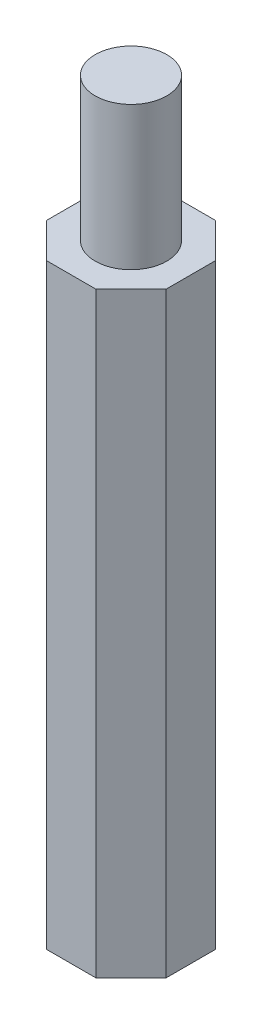
ISO-10303-21;
HEADER;
FILE_DESCRIPTION(('STEP AP214'),'2;1');
FILE_NAME('part.step','',(''),(''),'','','');
FILE_SCHEMA(('AUTOMOTIVE_DESIGN { 1 0 10303 214 1 1 1 1 }'));
ENDSEC;
DATA;
#1=APPLICATION_CONTEXT('core data for automotive mechanical design processes');
#2=APPLICATION_PROTOCOL_DEFINITION('international standard','automotive_design',2000,#1);
#3=PRODUCT_CONTEXT('',#1,'mechanical');
#4=PRODUCT('Part','Part','',(#3));
#5=PRODUCT_RELATED_PRODUCT_CATEGORY('part','',(#4));
#6=PRODUCT_DEFINITION_FORMATION('','',#4);
#7=PRODUCT_DEFINITION_CONTEXT('part definition',#1,'design');
#8=PRODUCT_DEFINITION('design','',#6,#7);
#9=PRODUCT_DEFINITION_SHAPE('','',#8);
#10=(LENGTH_UNIT() NAMED_UNIT(*) SI_UNIT(.MILLI.,.METRE.));
#11=(NAMED_UNIT(*) PLANE_ANGLE_UNIT() SI_UNIT($,.RADIAN.));
#12=(NAMED_UNIT(*) SI_UNIT($,.STERADIAN.) SOLID_ANGLE_UNIT());
#13=UNCERTAINTY_MEASURE_WITH_UNIT(LENGTH_MEASURE(1.E-05),#10,'distance_accuracy_value','');
#14=(GEOMETRIC_REPRESENTATION_CONTEXT(3) GLOBAL_UNCERTAINTY_ASSIGNED_CONTEXT((#13)) GLOBAL_UNIT_ASSIGNED_CONTEXT((#10,
#11,#12)) REPRESENTATION_CONTEXT('',''));
#15=CARTESIAN_POINT('',(0.,0.,0.));
#16=DIRECTION('',(0.,0.,1.));
#17=DIRECTION('',(1.,0.,0.));
#18=AXIS2_PLACEMENT_3D('',#15,#16,#17);
#19=CARTESIAN_POINT('',(-3.53553390593274,12.5,0.));
#20=DIRECTION('',(0.,1.,0.));
#21=DIRECTION('',(0.,0.,1.));
#22=AXIS2_PLACEMENT_3D('',#19,#20,#21);
#23=PLANE('',#22);
#24=DIRECTION('',(-0.707106781186549,0.,0.707106781186547));
#25=VECTOR('',#24,1.);
#26=CARTESIAN_POINT('',(-2.5,12.5,-1.03553390593274));
#27=LINE('',#26,#25);
#28=CARTESIAN_POINT('',(-1.03553390593274,12.5,-2.5));
#29=VERTEX_POINT('',#28);
#30=CARTESIAN_POINT('',(-2.5,12.5,-1.03553390593274));
#31=VERTEX_POINT('',#30);
#32=EDGE_CURVE('E144',#29,#31,#27,.T.);
#33=ORIENTED_EDGE('',*,*,#32,.T.);
#34=DIRECTION('',(0.,0.,1.));
#35=VECTOR('',#34,1.);
#36=CARTESIAN_POINT('',(-2.5,12.5,1.03553390593274));
#37=LINE('',#36,#35);
#38=CARTESIAN_POINT('',(-2.5,12.5,1.03553390593274));
#39=VERTEX_POINT('',#38);
#40=EDGE_CURVE('E92',#31,#39,#37,.T.);
#41=ORIENTED_EDGE('',*,*,#40,.T.);
#42=DIRECTION('',(0.707106781186548,0.,0.707106781186547));
#43=VECTOR('',#42,1.);
#44=CARTESIAN_POINT('',(-1.03553390593274,12.5,2.5));
#45=LINE('',#44,#43);
#46=CARTESIAN_POINT('',(-1.03553390593274,12.5,2.5));
#47=VERTEX_POINT('',#46);
#48=EDGE_CURVE('E159',#39,#47,#45,.T.);
#49=ORIENTED_EDGE('',*,*,#48,.T.);
#50=DIRECTION('',(1.,0.,0.));
#51=VECTOR('',#50,1.);
#52=CARTESIAN_POINT('',(1.03553390593274,12.5,2.5));
#53=LINE('',#52,#51);
#54=CARTESIAN_POINT('',(1.03553390593274,12.5,2.5));
#55=VERTEX_POINT('',#54);
#56=EDGE_CURVE('E171',#47,#55,#53,.T.);
#57=ORIENTED_EDGE('',*,*,#56,.T.);
#58=DIRECTION('',(0.707106781186548,0.,-0.707106781186547));
#59=VECTOR('',#58,1.);
#60=CARTESIAN_POINT('',(2.5,12.5,1.03553390593274));
#61=LINE('',#60,#59);
#62=CARTESIAN_POINT('',(2.5,12.5,1.03553390593274));
#63=VERTEX_POINT('',#62);
#64=EDGE_CURVE('E111',#55,#63,#61,.T.);
#65=ORIENTED_EDGE('',*,*,#64,.T.);
#66=DIRECTION('',(0.,0.,-1.));
#67=VECTOR('',#66,1.);
#68=CARTESIAN_POINT('',(2.5,12.5,-1.03553390593274));
#69=LINE('',#68,#67);
#70=CARTESIAN_POINT('',(2.5,12.5,-1.03553390593274));
#71=VERTEX_POINT('',#70);
#72=EDGE_CURVE('E105',#63,#71,#69,.T.);
#73=ORIENTED_EDGE('',*,*,#72,.T.);
#74=DIRECTION('',(-0.707106781186548,0.,-0.707106781186547));
#75=VECTOR('',#74,1.);
#76=CARTESIAN_POINT('',(1.03553390593274,12.5,-2.5));
#77=LINE('',#76,#75);
#78=CARTESIAN_POINT('',(1.03553390593274,12.5,-2.5));
#79=VERTEX_POINT('',#78);
#80=EDGE_CURVE('E109',#71,#79,#77,.T.);
#81=ORIENTED_EDGE('',*,*,#80,.T.);
#82=DIRECTION('',(-1.,0.,0.));
#83=VECTOR('',#82,1.);
#84=CARTESIAN_POINT('',(-1.03553390593274,12.5,-2.5));
#85=LINE('',#84,#83);
#86=EDGE_CURVE('E49',#79,#29,#85,.T.);
#87=ORIENTED_EDGE('',*,*,#86,.T.);
#88=EDGE_LOOP('',(#33,#41,#49,#57,#65,#73,#81,#87));
#89=FACE_BOUND('',#88,.T.);
#90=CARTESIAN_POINT('',(0.,12.5,0.));
#91=DIRECTION('',(0.,1.,0.));
#92=DIRECTION('',(0.,0.,1.));
#93=AXIS2_PLACEMENT_3D('',#90,#91,#92);
#94=CIRCLE('',#93,1.5);
#95=CARTESIAN_POINT('',(0.,12.5,1.5));
#96=VERTEX_POINT('',#95);
#97=EDGE_CURVE('E177',#96,#96,#94,.T.);
#98=ORIENTED_EDGE('',*,*,#97,.F.);
#99=EDGE_LOOP('',(#98));
#100=FACE_BOUND('',#99,.T.);
#101=ADVANCED_FACE('F32',(#89,#100),#23,.T.);
#102=CARTESIAN_POINT('',(-2.5,12.5,-1.03553390593274));
#103=DIRECTION('',(0.707106781186547,0.,0.707106781186548));
#104=DIRECTION('',(0.707106781186548,0.,-0.707106781186547));
#105=AXIS2_PLACEMENT_3D('',#102,#103,#104);
#106=PLANE('',#105);
#107=DIRECTION('',(-0.707106781186549,0.,0.707106781186547));
#108=VECTOR('',#107,1.);
#109=CARTESIAN_POINT('',(-2.5,-12.5,-1.03553390593274));
#110=LINE('',#109,#108);
#111=CARTESIAN_POINT('',(-1.03553390593274,-12.5,-2.5));
#112=VERTEX_POINT('',#111);
#113=CARTESIAN_POINT('',(-2.5,-12.5,-1.03553390593274));
#114=VERTEX_POINT('',#113);
#115=EDGE_CURVE('E129',#112,#114,#110,.T.);
#116=ORIENTED_EDGE('',*,*,#115,.T.);
#117=DIRECTION('',(0.,-1.,0.));
#118=VECTOR('',#117,1.);
#119=CARTESIAN_POINT('',(-2.5,12.5,-1.03553390593274));
#120=LINE('',#119,#118);
#121=EDGE_CURVE('E11',#31,#114,#120,.T.);
#122=ORIENTED_EDGE('',*,*,#121,.F.);
#123=ORIENTED_EDGE('',*,*,#32,.F.);
#124=DIRECTION('',(0.,-1.,0.));
#125=VECTOR('',#124,1.);
#126=CARTESIAN_POINT('',(-1.03553390593274,12.5,-2.5));
#127=LINE('',#126,#125);
#128=EDGE_CURVE('E125',#29,#112,#127,.T.);
#129=ORIENTED_EDGE('',*,*,#128,.T.);
#130=EDGE_LOOP('',(#116,#122,#123,#129));
#131=FACE_BOUND('',#130,.T.);
#132=ADVANCED_FACE('F34',(#131),#106,.F.);
#133=CARTESIAN_POINT('',(-2.5,12.5,1.03553390593274));
#134=DIRECTION('',(1.,0.,0.));
#135=DIRECTION('',(0.,0.,-1.));
#136=AXIS2_PLACEMENT_3D('',#133,#134,#135);
#137=PLANE('',#136);
#138=DIRECTION('',(0.,0.,1.));
#139=VECTOR('',#138,1.);
#140=CARTESIAN_POINT('',(-2.5,-12.5,1.03553390593274));
#141=LINE('',#140,#139);
#142=CARTESIAN_POINT('',(-2.5,-12.5,1.03553390593274));
#143=VERTEX_POINT('',#142);
#144=EDGE_CURVE('E132',#114,#143,#141,.T.);
#145=ORIENTED_EDGE('',*,*,#144,.T.);
#146=DIRECTION('',(0.,-1.,0.));
#147=VECTOR('',#146,1.);
#148=CARTESIAN_POINT('',(-2.5,12.5,1.03553390593274));
#149=LINE('',#148,#147);
#150=EDGE_CURVE('E41',#39,#143,#149,.T.);
#151=ORIENTED_EDGE('',*,*,#150,.F.);
#152=ORIENTED_EDGE('',*,*,#40,.F.);
#153=ORIENTED_EDGE('',*,*,#121,.T.);
#154=EDGE_LOOP('',(#145,#151,#152,#153));
#155=FACE_BOUND('',#154,.T.);
#156=ADVANCED_FACE('F214',(#155),#137,.F.);
#157=CARTESIAN_POINT('',(-1.03553390593274,12.5,2.5));
#158=DIRECTION('',(0.707106781186547,0.,-0.707106781186548));
#159=DIRECTION('',(-0.707106781186548,0.,-0.707106781186547));
#160=AXIS2_PLACEMENT_3D('',#157,#158,#159);
#161=PLANE('',#160);
#162=DIRECTION('',(0.707106781186548,0.,0.707106781186547));
#163=VECTOR('',#162,1.);
#164=CARTESIAN_POINT('',(-1.03553390593274,-12.5,2.5));
#165=LINE('',#164,#163);
#166=CARTESIAN_POINT('',(-1.03553390593274,-12.5,2.5));
#167=VERTEX_POINT('',#166);
#168=EDGE_CURVE('E135',#143,#167,#165,.T.);
#169=ORIENTED_EDGE('',*,*,#168,.T.);
#170=DIRECTION('',(0.,-1.,0.));
#171=VECTOR('',#170,1.);
#172=CARTESIAN_POINT('',(-1.03553390593274,12.5,2.5));
#173=LINE('',#172,#171);
#174=EDGE_CURVE('E151',#47,#167,#173,.T.);
#175=ORIENTED_EDGE('',*,*,#174,.F.);
#176=ORIENTED_EDGE('',*,*,#48,.F.);
#177=ORIENTED_EDGE('',*,*,#150,.T.);
#178=EDGE_LOOP('',(#169,#175,#176,#177));
#179=FACE_BOUND('',#178,.T.);
#180=ADVANCED_FACE('F157',(#179),#161,.F.);
#181=CARTESIAN_POINT('',(1.03553390593274,12.5,2.5));
#182=DIRECTION('',(0.,0.,-1.));
#183=DIRECTION('',(-1.,0.,0.));
#184=AXIS2_PLACEMENT_3D('',#181,#182,#183);
#185=PLANE('',#184);
#186=DIRECTION('',(1.,0.,0.));
#187=VECTOR('',#186,1.);
#188=CARTESIAN_POINT('',(1.03553390593274,-12.5,2.5));
#189=LINE('',#188,#187);
#190=CARTESIAN_POINT('',(1.03553390593274,-12.5,2.5));
#191=VERTEX_POINT('',#190);
#192=EDGE_CURVE('E137',#167,#191,#189,.T.);
#193=ORIENTED_EDGE('',*,*,#192,.T.);
#194=DIRECTION('',(0.,-1.,0.));
#195=VECTOR('',#194,1.);
#196=CARTESIAN_POINT('',(1.03553390593274,12.5,2.5));
#197=LINE('',#196,#195);
#198=EDGE_CURVE('E148',#55,#191,#197,.T.);
#199=ORIENTED_EDGE('',*,*,#198,.F.);
#200=ORIENTED_EDGE('',*,*,#56,.F.);
#201=ORIENTED_EDGE('',*,*,#174,.T.);
#202=EDGE_LOOP('',(#193,#199,#200,#201));
#203=FACE_BOUND('',#202,.T.);
#204=ADVANCED_FACE('F167',(#203),#185,.F.);
#205=CARTESIAN_POINT('',(2.5,12.5,1.03553390593274));
#206=DIRECTION('',(-0.707106781186547,0.,-0.707106781186548));
#207=DIRECTION('',(-0.707106781186548,0.,0.707106781186547));
#208=AXIS2_PLACEMENT_3D('',#205,#206,#207);
#209=PLANE('',#208);
#210=DIRECTION('',(0.707106781186548,0.,-0.707106781186547));
#211=VECTOR('',#210,1.);
#212=CARTESIAN_POINT('',(2.5,-12.5,1.03553390593274));
#213=LINE('',#212,#211);
#214=CARTESIAN_POINT('',(2.5,-12.5,1.03553390593274));
#215=VERTEX_POINT('',#214);
#216=EDGE_CURVE('E139',#191,#215,#213,.T.);
#217=ORIENTED_EDGE('',*,*,#216,.T.);
#218=DIRECTION('',(0.,-1.,0.));
#219=VECTOR('',#218,1.);
#220=CARTESIAN_POINT('',(2.5,12.5,1.03553390593274));
#221=LINE('',#220,#219);
#222=EDGE_CURVE('E120',#63,#215,#221,.T.);
#223=ORIENTED_EDGE('',*,*,#222,.F.);
#224=ORIENTED_EDGE('',*,*,#64,.F.);
#225=ORIENTED_EDGE('',*,*,#198,.T.);
#226=EDGE_LOOP('',(#217,#223,#224,#225));
#227=FACE_BOUND('',#226,.T.);
#228=ADVANCED_FACE('F170',(#227),#209,.F.);
#229=CARTESIAN_POINT('',(2.5,12.5,-1.03553390593274));
#230=DIRECTION('',(-1.,0.,0.));
#231=DIRECTION('',(0.,0.,1.));
#232=AXIS2_PLACEMENT_3D('',#229,#230,#231);
#233=PLANE('',#232);
#234=DIRECTION('',(0.,0.,-1.));
#235=VECTOR('',#234,1.);
#236=CARTESIAN_POINT('',(2.5,-12.5,-1.03553390593274));
#237=LINE('',#236,#235);
#238=CARTESIAN_POINT('',(2.5,-12.5,-1.03553390593274));
#239=VERTEX_POINT('',#238);
#240=EDGE_CURVE('E119',#215,#239,#237,.T.);
#241=ORIENTED_EDGE('',*,*,#240,.T.);
#242=DIRECTION('',(0.,-1.,0.));
#243=VECTOR('',#242,1.);
#244=CARTESIAN_POINT('',(2.5,12.5,-1.03553390593274));
#245=LINE('',#244,#243);
#246=EDGE_CURVE('E116',#71,#239,#245,.T.);
#247=ORIENTED_EDGE('',*,*,#246,.F.);
#248=ORIENTED_EDGE('',*,*,#72,.F.);
#249=ORIENTED_EDGE('',*,*,#222,.T.);
#250=EDGE_LOOP('',(#241,#247,#248,#249));
#251=FACE_BOUND('',#250,.T.);
#252=ADVANCED_FACE('F117',(#251),#233,.F.);
#253=CARTESIAN_POINT('',(1.03553390593274,12.5,-2.5));
#254=DIRECTION('',(-0.707106781186547,0.,0.707106781186548));
#255=DIRECTION('',(0.707106781186548,0.,0.707106781186547));
#256=AXIS2_PLACEMENT_3D('',#253,#254,#255);
#257=PLANE('',#256);
#258=DIRECTION('',(-0.707106781186548,0.,-0.707106781186547));
#259=VECTOR('',#258,1.);
#260=CARTESIAN_POINT('',(1.03553390593274,-12.5,-2.5));
#261=LINE('',#260,#259);
#262=CARTESIAN_POINT('',(1.03553390593274,-12.5,-2.5));
#263=VERTEX_POINT('',#262);
#264=EDGE_CURVE('E78',#239,#263,#261,.T.);
#265=ORIENTED_EDGE('',*,*,#264,.T.);
#266=DIRECTION('',(0.,-1.,0.));
#267=VECTOR('',#266,1.);
#268=CARTESIAN_POINT('',(1.03553390593274,12.5,-2.5));
#269=LINE('',#268,#267);
#270=EDGE_CURVE('E121',#79,#263,#269,.T.);
#271=ORIENTED_EDGE('',*,*,#270,.F.);
#272=ORIENTED_EDGE('',*,*,#80,.F.);
#273=ORIENTED_EDGE('',*,*,#246,.T.);
#274=EDGE_LOOP('',(#265,#271,#272,#273));
#275=FACE_BOUND('',#274,.T.);
#276=ADVANCED_FACE('F123',(#275),#257,.F.);
#277=CARTESIAN_POINT('',(-1.03553390593274,12.5,-2.5));
#278=DIRECTION('',(0.,0.,1.));
#279=DIRECTION('',(1.,0.,0.));
#280=AXIS2_PLACEMENT_3D('',#277,#278,#279);
#281=PLANE('',#280);
#282=DIRECTION('',(-1.,0.,0.));
#283=VECTOR('',#282,1.);
#284=CARTESIAN_POINT('',(-1.03553390593274,-12.5,-2.5));
#285=LINE('',#284,#283);
#286=EDGE_CURVE('E84',#263,#112,#285,.T.);
#287=ORIENTED_EDGE('',*,*,#286,.T.);
#288=ORIENTED_EDGE('',*,*,#128,.F.);
#289=ORIENTED_EDGE('',*,*,#86,.F.);
#290=ORIENTED_EDGE('',*,*,#270,.T.);
#291=EDGE_LOOP('',(#287,#288,#289,#290));
#292=FACE_BOUND('',#291,.T.);
#293=ADVANCED_FACE('F200',(#292),#281,.F.);
#294=CARTESIAN_POINT('',(-3.53553390593274,-12.5,0.));
#295=DIRECTION('',(0.,1.,0.));
#296=DIRECTION('',(0.,0.,1.));
#297=AXIS2_PLACEMENT_3D('',#294,#295,#296);
#298=PLANE('',#297);
#299=CARTESIAN_POINT('',(0.,-12.5,0.));
#300=DIRECTION('',(0.,-1.,0.));
#301=DIRECTION('',(0.,0.,-1.));
#302=AXIS2_PLACEMENT_3D('',#299,#300,#301);
#303=CIRCLE('',#302,1.5);
#304=CARTESIAN_POINT('',(0.,-12.5,-1.5));
#305=VERTEX_POINT('',#304);
#306=EDGE_CURVE('E183',#305,#305,#303,.T.);
#307=ORIENTED_EDGE('',*,*,#306,.F.);
#308=EDGE_LOOP('',(#307));
#309=FACE_BOUND('',#308,.T.);
#310=ORIENTED_EDGE('',*,*,#115,.F.);
#311=ORIENTED_EDGE('',*,*,#286,.F.);
#312=ORIENTED_EDGE('',*,*,#264,.F.);
#313=ORIENTED_EDGE('',*,*,#240,.F.);
#314=ORIENTED_EDGE('',*,*,#216,.F.);
#315=ORIENTED_EDGE('',*,*,#192,.F.);
#316=ORIENTED_EDGE('',*,*,#168,.F.);
#317=ORIENTED_EDGE('',*,*,#144,.F.);
#318=EDGE_LOOP('',(#310,#311,#312,#313,#314,#315,#316,#317));
#319=FACE_BOUND('',#318,.T.);
#320=ADVANCED_FACE('F163',(#309,#319),#298,.F.);
#321=CARTESIAN_POINT('',(0.,18.5,0.));
#322=DIRECTION('',(0.,-1.,0.));
#323=DIRECTION('',(0.,0.,-1.));
#324=AXIS2_PLACEMENT_3D('',#321,#322,#323);
#325=CYLINDRICAL_SURFACE('',#324,1.5);
#326=CARTESIAN_POINT('',(0.,18.5,0.));
#327=DIRECTION('',(0.,1.,0.));
#328=DIRECTION('',(0.,0.,1.));
#329=AXIS2_PLACEMENT_3D('',#326,#327,#328);
#330=CIRCLE('',#329,1.5);
#331=CARTESIAN_POINT('',(0.,18.5,1.5));
#332=VERTEX_POINT('',#331);
#333=EDGE_CURVE('E133',#332,#332,#330,.T.);
#334=ORIENTED_EDGE('',*,*,#333,.F.);
#335=EDGE_LOOP('',(#334));
#336=FACE_BOUND('',#335,.T.);
#337=ORIENTED_EDGE('',*,*,#97,.T.);
#338=EDGE_LOOP('',(#337));
#339=FACE_BOUND('',#338,.T.);
#340=ADVANCED_FACE('F199',(#336,#339),#325,.T.);
#341=CARTESIAN_POINT('',(0.,18.5,0.));
#342=DIRECTION('',(0.,1.,0.));
#343=DIRECTION('',(0.,0.,1.));
#344=AXIS2_PLACEMENT_3D('',#341,#342,#343);
#345=PLANE('',#344);
#346=ORIENTED_EDGE('',*,*,#333,.T.);
#347=EDGE_LOOP('',(#346));
#348=FACE_BOUND('',#347,.T.);
#349=ADVANCED_FACE('F194',(#348),#345,.T.);
#350=CARTESIAN_POINT('',(0.,-5.5,0.));
#351=DIRECTION('',(0.,-1.,0.));
#352=DIRECTION('',(0.,0.,-1.));
#353=AXIS2_PLACEMENT_3D('',#350,#351,#352);
#354=CYLINDRICAL_SURFACE('',#353,1.5);
#355=CARTESIAN_POINT('',(0.,-5.5,0.));
#356=DIRECTION('',(0.,-1.,0.));
#357=DIRECTION('',(0.,0.,-1.));
#358=AXIS2_PLACEMENT_3D('',#355,#356,#357);
#359=CIRCLE('',#358,1.5);
#360=CARTESIAN_POINT('',(0.,-5.5,-1.5));
#361=VERTEX_POINT('',#360);
#362=EDGE_CURVE('E180',#361,#361,#359,.T.);
#363=ORIENTED_EDGE('',*,*,#362,.F.);
#364=EDGE_LOOP('',(#363));
#365=FACE_BOUND('',#364,.T.);
#366=ORIENTED_EDGE('',*,*,#306,.T.);
#367=EDGE_LOOP('',(#366));
#368=FACE_BOUND('',#367,.T.);
#369=ADVANCED_FACE('F191',(#365,#368),#354,.F.);
#370=CARTESIAN_POINT('',(0.,-5.5,0.));
#371=DIRECTION('',(0.,-1.,0.));
#372=DIRECTION('',(0.,0.,-1.));
#373=AXIS2_PLACEMENT_3D('',#370,#371,#372);
#374=PLANE('',#373);
#375=ORIENTED_EDGE('',*,*,#362,.T.);
#376=EDGE_LOOP('',(#375));
#377=FACE_BOUND('',#376,.T.);
#378=ADVANCED_FACE('F189',(#377),#374,.T.);
#379=CLOSED_SHELL('',(#101,#132,#156,#180,#204,#228,#252,#276,#293,#320,#340,#349,#369,#378));
#380=MANIFOLD_SOLID_BREP('B2',#379);
#381=ADVANCED_BREP_SHAPE_REPRESENTATION('',(#18,#380),#14);
#382=SHAPE_DEFINITION_REPRESENTATION(#9,#381);
ENDSEC;
END-ISO-10303-21;
